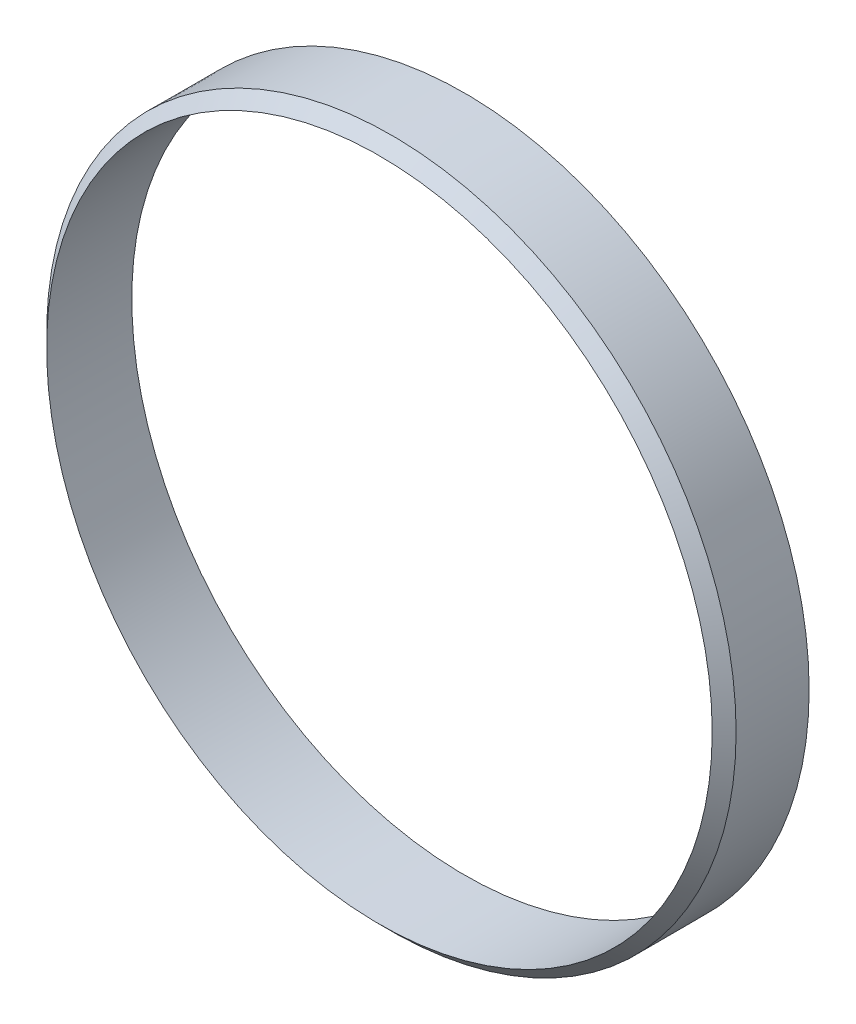
ISO-10303-21;
HEADER;
FILE_DESCRIPTION(('STEP AP214'),'2;1');
FILE_NAME('part.step','',(''),(''),'','','');
FILE_SCHEMA(('AUTOMOTIVE_DESIGN { 1 0 10303 214 1 1 1 1 }'));
ENDSEC;
DATA;
#1=APPLICATION_CONTEXT('core data for automotive mechanical design processes');
#2=APPLICATION_PROTOCOL_DEFINITION('international standard','automotive_design',2000,#1);
#3=PRODUCT_CONTEXT('',#1,'mechanical');
#4=PRODUCT('Part','Part','',(#3));
#5=PRODUCT_RELATED_PRODUCT_CATEGORY('part','',(#4));
#6=PRODUCT_DEFINITION_FORMATION('','',#4);
#7=PRODUCT_DEFINITION_CONTEXT('part definition',#1,'design');
#8=PRODUCT_DEFINITION('design','',#6,#7);
#9=PRODUCT_DEFINITION_SHAPE('','',#8);
#10=(LENGTH_UNIT() NAMED_UNIT(*) SI_UNIT(.MILLI.,.METRE.));
#11=(NAMED_UNIT(*) PLANE_ANGLE_UNIT() SI_UNIT($,.RADIAN.));
#12=(NAMED_UNIT(*) SI_UNIT($,.STERADIAN.) SOLID_ANGLE_UNIT());
#13=UNCERTAINTY_MEASURE_WITH_UNIT(LENGTH_MEASURE(1.E-05),#10,'distance_accuracy_value','');
#14=(GEOMETRIC_REPRESENTATION_CONTEXT(3) GLOBAL_UNCERTAINTY_ASSIGNED_CONTEXT((#13)) GLOBAL_UNIT_ASSIGNED_CONTEXT((#10,
#11,#12)) REPRESENTATION_CONTEXT('',''));
#15=CARTESIAN_POINT('',(0.,0.,0.));
#16=DIRECTION('',(0.,0.,1.));
#17=DIRECTION('',(1.,0.,0.));
#18=AXIS2_PLACEMENT_3D('',#15,#16,#17);
#19=CARTESIAN_POINT('',(5.31338861797792E-10,1.61823005059267E-13,-5.));
#20=DIRECTION('',(0.,0.,1.));
#21=DIRECTION('',(1.,0.,0.));
#22=AXIS2_PLACEMENT_3D('',#19,#20,#21);
#23=CYLINDRICAL_SURFACE('',#22,87.8697032440481);
#24=CARTESIAN_POINT('',(5.31338861797792E-10,1.61823005059267E-13,0.));
#25=DIRECTION('',(0.,0.,-1.));
#26=DIRECTION('',(-1.,0.,0.));
#27=AXIS2_PLACEMENT_3D('',#24,#25,#26);
#28=CIRCLE('',#27,87.8697032440481);
#29=CARTESIAN_POINT('',(-87.8341320222596,-2.50000000000008,0.));
#30=VERTEX_POINT('',#29);
#31=CARTESIAN_POINT('',(-87.8341320222596,2.49999999999992,0.));
#32=VERTEX_POINT('',#31);
#33=EDGE_CURVE('E106',#30,#32,#28,.T.);
#34=ORIENTED_EDGE('',*,*,#33,.T.);
#35=DIRECTION('',(0.,0.,1.));
#36=VECTOR('',#35,1.);
#37=CARTESIAN_POINT('',(-87.8341320222596,2.49999999999992,-5.));
#38=LINE('',#37,#36);
#39=CARTESIAN_POINT('',(-87.8341320222596,2.49999999999992,-5.));
#40=VERTEX_POINT('',#39);
#41=EDGE_CURVE('E12',#40,#32,#38,.T.);
#42=ORIENTED_EDGE('',*,*,#41,.F.);
#43=CARTESIAN_POINT('',(5.31338861797792E-10,1.61823005059267E-13,-5.));
#44=DIRECTION('',(0.,0.,-1.));
#45=DIRECTION('',(-1.,0.,0.));
#46=AXIS2_PLACEMENT_3D('',#43,#44,#45);
#47=CIRCLE('',#46,87.8697032440481);
#48=CARTESIAN_POINT('',(-87.8341320222596,-2.50000000000008,-5.));
#49=VERTEX_POINT('',#48);
#50=EDGE_CURVE('E94',#49,#40,#47,.T.);
#51=ORIENTED_EDGE('',*,*,#50,.F.);
#52=DIRECTION('',(0.,0.,1.));
#53=VECTOR('',#52,1.);
#54=CARTESIAN_POINT('',(-87.8341320222596,-2.50000000000008,-5.));
#55=LINE('',#54,#53);
#56=EDGE_CURVE('E102',#49,#30,#55,.T.);
#57=ORIENTED_EDGE('',*,*,#56,.T.);
#58=EDGE_LOOP('',(#34,#42,#51,#57));
#59=FACE_BOUND('',#58,.T.);
#60=ADVANCED_FACE('F43',(#59),#23,.T.);
#61=CARTESIAN_POINT('',(-80.9614105608345,2.49999999999992,-5.));
#62=DIRECTION('',(0.,-1.,0.));
#63=DIRECTION('',(0.,0.,-1.));
#64=AXIS2_PLACEMENT_3D('',#61,#62,#63);
#65=PLANE('',#64);
#66=DIRECTION('',(1.,0.,0.));
#67=VECTOR('',#66,1.);
#68=CARTESIAN_POINT('',(-80.9614105608345,2.49999999999992,0.));
#69=LINE('',#68,#67);
#70=CARTESIAN_POINT('',(-80.9614105608345,2.49999999999994,0.));
#71=VERTEX_POINT('',#70);
#72=EDGE_CURVE('E98',#32,#71,#69,.T.);
#73=ORIENTED_EDGE('',*,*,#72,.T.);
#74=DIRECTION('',(0.,0.,1.));
#75=VECTOR('',#74,1.);
#76=CARTESIAN_POINT('',(-80.9614105608345,2.49999999999994,-5.));
#77=LINE('',#76,#75);
#78=CARTESIAN_POINT('',(-80.9614105608345,2.49999999999994,-5.));
#79=VERTEX_POINT('',#78);
#80=EDGE_CURVE('E51',#79,#71,#77,.T.);
#81=ORIENTED_EDGE('',*,*,#80,.F.);
#82=DIRECTION('',(1.,0.,0.));
#83=VECTOR('',#82,1.);
#84=CARTESIAN_POINT('',(-80.9614105608345,2.49999999999992,-5.));
#85=LINE('',#84,#83);
#86=EDGE_CURVE('E89',#40,#79,#85,.T.);
#87=ORIENTED_EDGE('',*,*,#86,.F.);
#88=ORIENTED_EDGE('',*,*,#41,.T.);
#89=EDGE_LOOP('',(#73,#81,#87,#88));
#90=FACE_BOUND('',#89,.T.);
#91=ADVANCED_FACE('F97',(#90),#65,.F.);
#92=CARTESIAN_POINT('',(5.56124590822549E-10,0.,-5.));
#93=DIRECTION('',(0.,0.,1.));
#94=DIRECTION('',(1.,0.,0.));
#95=AXIS2_PLACEMENT_3D('',#92,#93,#94);
#96=CYLINDRICAL_SURFACE('',#95,81.0000000005559);
#97=CARTESIAN_POINT('',(5.56124590822549E-10,0.,0.));
#98=DIRECTION('',(0.,0.,1.));
#99=DIRECTION('',(-1.,0.,0.));
#100=AXIS2_PLACEMENT_3D('',#97,#98,#99);
#101=CIRCLE('',#100,81.0000000005559);
#102=CARTESIAN_POINT('',(-80.9614105608345,-2.50000000000008,0.));
#103=VERTEX_POINT('',#102);
#104=EDGE_CURVE('E76',#71,#103,#101,.T.);
#105=ORIENTED_EDGE('',*,*,#104,.T.);
#106=DIRECTION('',(0.,0.,1.));
#107=VECTOR('',#106,1.);
#108=CARTESIAN_POINT('',(-80.9614105608345,-2.50000000000008,-5.));
#109=LINE('',#108,#107);
#110=CARTESIAN_POINT('',(-80.9614105608345,-2.50000000000008,-5.));
#111=VERTEX_POINT('',#110);
#112=EDGE_CURVE('E99',#111,#103,#109,.T.);
#113=ORIENTED_EDGE('',*,*,#112,.F.);
#114=CARTESIAN_POINT('',(5.56124590822549E-10,0.,-5.));
#115=DIRECTION('',(0.,0.,1.));
#116=DIRECTION('',(-1.,0.,0.));
#117=AXIS2_PLACEMENT_3D('',#114,#115,#116);
#118=CIRCLE('',#117,81.0000000005559);
#119=EDGE_CURVE('E92',#79,#111,#118,.T.);
#120=ORIENTED_EDGE('',*,*,#119,.F.);
#121=ORIENTED_EDGE('',*,*,#80,.T.);
#122=EDGE_LOOP('',(#105,#113,#120,#121));
#123=FACE_BOUND('',#122,.T.);
#124=ADVANCED_FACE('F100',(#123),#96,.F.);
#125=CARTESIAN_POINT('',(-80.9614105608345,-2.50000000000008,-5.));
#126=DIRECTION('',(0.,1.,0.));
#127=DIRECTION('',(0.,0.,1.));
#128=AXIS2_PLACEMENT_3D('',#125,#126,#127);
#129=PLANE('',#128);
#130=DIRECTION('',(-1.,0.,0.));
#131=VECTOR('',#130,1.);
#132=CARTESIAN_POINT('',(-80.9614105608345,-2.50000000000008,0.));
#133=LINE('',#132,#131);
#134=EDGE_CURVE('E82',#103,#30,#133,.T.);
#135=ORIENTED_EDGE('',*,*,#134,.T.);
#136=ORIENTED_EDGE('',*,*,#56,.F.);
#137=DIRECTION('',(-1.,0.,0.));
#138=VECTOR('',#137,1.);
#139=CARTESIAN_POINT('',(-80.9614105608345,-2.50000000000008,-5.));
#140=LINE('',#139,#138);
#141=EDGE_CURVE('E59',#111,#49,#140,.T.);
#142=ORIENTED_EDGE('',*,*,#141,.F.);
#143=ORIENTED_EDGE('',*,*,#112,.T.);
#144=EDGE_LOOP('',(#135,#136,#142,#143));
#145=FACE_BOUND('',#144,.T.);
#146=ADVANCED_FACE('F113',(#145),#129,.F.);
#147=CARTESIAN_POINT('',(5.31338861797792E-10,1.61823005059267E-13,-5.));
#148=DIRECTION('',(0.,0.,-1.));
#149=DIRECTION('',(-1.,0.,0.));
#150=AXIS2_PLACEMENT_3D('',#147,#148,#149);
#151=PLANE('',#150);
#152=ORIENTED_EDGE('',*,*,#50,.T.);
#153=ORIENTED_EDGE('',*,*,#86,.T.);
#154=ORIENTED_EDGE('',*,*,#119,.T.);
#155=ORIENTED_EDGE('',*,*,#141,.T.);
#156=EDGE_LOOP('',(#152,#153,#154,#155));
#157=FACE_BOUND('',#156,.T.);
#158=ADVANCED_FACE('F90',(#157),#151,.T.);
#159=CARTESIAN_POINT('',(5.31338861797792E-10,1.61823005059267E-13,0.));
#160=DIRECTION('',(0.,0.,-1.));
#161=DIRECTION('',(-1.,0.,0.));
#162=AXIS2_PLACEMENT_3D('',#159,#160,#161);
#163=PLANE('',#162);
#164=ORIENTED_EDGE('',*,*,#33,.F.);
#165=ORIENTED_EDGE('',*,*,#134,.F.);
#166=ORIENTED_EDGE('',*,*,#104,.F.);
#167=ORIENTED_EDGE('',*,*,#72,.F.);
#168=EDGE_LOOP('',(#164,#165,#166,#167));
#169=FACE_BOUND('',#168,.T.);
#170=ADVANCED_FACE('F116',(#169),#163,.F.);
#171=CLOSED_SHELL('',(#60,#91,#124,#146,#158,#170));
#172=MANIFOLD_SOLID_BREP('B2_NOT_SHOWN',#171);
#173=CARTESIAN_POINT('',(0.,0.,14.8697032435169));
#174=DIRECTION('',(0.,0.,-1.));
#175=DIRECTION('',(-1.,0.,0.));
#176=AXIS2_PLACEMENT_3D('',#173,#174,#175);
#177=CONICAL_SURFACE('',#176,81.,0.785398163397453);
#178=CARTESIAN_POINT('',(0.,0.,17.6776695296636));
#179=DIRECTION('',(0.,0.,1.));
#180=DIRECTION('',(1.,0.,0.));
#181=AXIS2_PLACEMENT_3D('',#178,#179,#180);
#182=CIRCLE('',#181,78.1920337138532);
#183=CARTESIAN_POINT('',(78.1920337138532,0.,17.6776695296636));
#184=VERTEX_POINT('',#183);
#185=EDGE_CURVE('E181',#184,#184,#182,.T.);
#186=ORIENTED_EDGE('',*,*,#185,.F.);
#187=EDGE_LOOP('',(#186));
#188=FACE_BOUND('',#187,.T.);
#189=CARTESIAN_POINT('',(0.,0.,14.8697032435169));
#190=DIRECTION('',(0.,0.,1.));
#191=DIRECTION('',(1.,0.,0.));
#192=AXIS2_PLACEMENT_3D('',#189,#190,#191);
#193=CIRCLE('',#192,81.);
#194=CARTESIAN_POINT('',(81.,0.,14.8697032435169));
#195=VERTEX_POINT('',#194);
#196=EDGE_CURVE('E42',#195,#195,#193,.T.);
#197=ORIENTED_EDGE('',*,*,#196,.T.);
#198=EDGE_LOOP('',(#197));
#199=FACE_BOUND('',#198,.T.);
#200=ADVANCED_FACE('F167',(#188,#199),#177,.T.);
#201=CARTESIAN_POINT('',(0.,0.,-2.32233047033635));
#202=DIRECTION('',(0.,0.,1.));
#203=DIRECTION('',(1.,0.,0.));
#204=AXIS2_PLACEMENT_3D('',#201,#202,#203);
#205=CONICAL_SURFACE('',#204,80.9667016815342,0.0019368433881663);
#206=ORIENTED_EDGE('',*,*,#196,.F.);
#207=EDGE_LOOP('',(#206));
#208=FACE_BOUND('',#207,.T.);
#209=CARTESIAN_POINT('',(0.,0.,-2.32233047033635));
#210=DIRECTION('',(0.,0.,1.));
#211=DIRECTION('',(1.,0.,0.));
#212=AXIS2_PLACEMENT_3D('',#209,#210,#211);
#213=CIRCLE('',#212,80.9667016815342);
#214=CARTESIAN_POINT('',(80.9667016815342,0.,-2.32233047033635));
#215=VERTEX_POINT('',#214);
#216=EDGE_CURVE('E173',#215,#215,#213,.T.);
#217=ORIENTED_EDGE('',*,*,#216,.T.);
#218=EDGE_LOOP('',(#217));
#219=FACE_BOUND('',#218,.T.);
#220=ADVANCED_FACE('F190',(#208,#219),#205,.T.);
#221=CARTESIAN_POINT('',(-78.1920337138532,0.,-2.32233047033635));
#222=DIRECTION('',(0.,0.,1.));
#223=DIRECTION('',(1.,0.,0.));
#224=AXIS2_PLACEMENT_3D('',#221,#222,#223);
#225=PLANE('',#224);
#226=ORIENTED_EDGE('',*,*,#216,.F.);
#227=EDGE_LOOP('',(#226));
#228=FACE_BOUND('',#227,.T.);
#229=CARTESIAN_POINT('',(0.,0.,-2.32233047033635));
#230=DIRECTION('',(0.,0.,1.));
#231=DIRECTION('',(1.,0.,0.));
#232=AXIS2_PLACEMENT_3D('',#229,#230,#231);
#233=CIRCLE('',#232,78.1920337138532);
#234=CARTESIAN_POINT('',(78.1920337138532,0.,-2.32233047033635));
#235=VERTEX_POINT('',#234);
#236=EDGE_CURVE('E177',#235,#235,#233,.T.);
#237=ORIENTED_EDGE('',*,*,#236,.T.);
#238=EDGE_LOOP('',(#237));
#239=FACE_BOUND('',#238,.T.);
#240=ADVANCED_FACE('F194',(#228,#239),#225,.F.);
#241=CARTESIAN_POINT('',(0.,0.,0.));
#242=DIRECTION('',(0.,0.,1.));
#243=DIRECTION('',(1.,0.,0.));
#244=AXIS2_PLACEMENT_3D('',#241,#242,#243);
#245=CYLINDRICAL_SURFACE('',#244,78.1920337138532);
#246=ORIENTED_EDGE('',*,*,#236,.F.);
#247=EDGE_LOOP('',(#246));
#248=FACE_BOUND('',#247,.T.);
#249=ORIENTED_EDGE('',*,*,#185,.T.);
#250=EDGE_LOOP('',(#249));
#251=FACE_BOUND('',#250,.T.);
#252=ADVANCED_FACE('F187',(#248,#251),#245,.F.);
#253=CLOSED_SHELL('',(#200,#220,#240,#252));
#254=MANIFOLD_SOLID_BREP('B6',#253);
#255=ADVANCED_BREP_SHAPE_REPRESENTATION('',(#18,#172,#254),#14);
#256=SHAPE_DEFINITION_REPRESENTATION(#9,#255);
ENDSEC;
END-ISO-10303-21;
